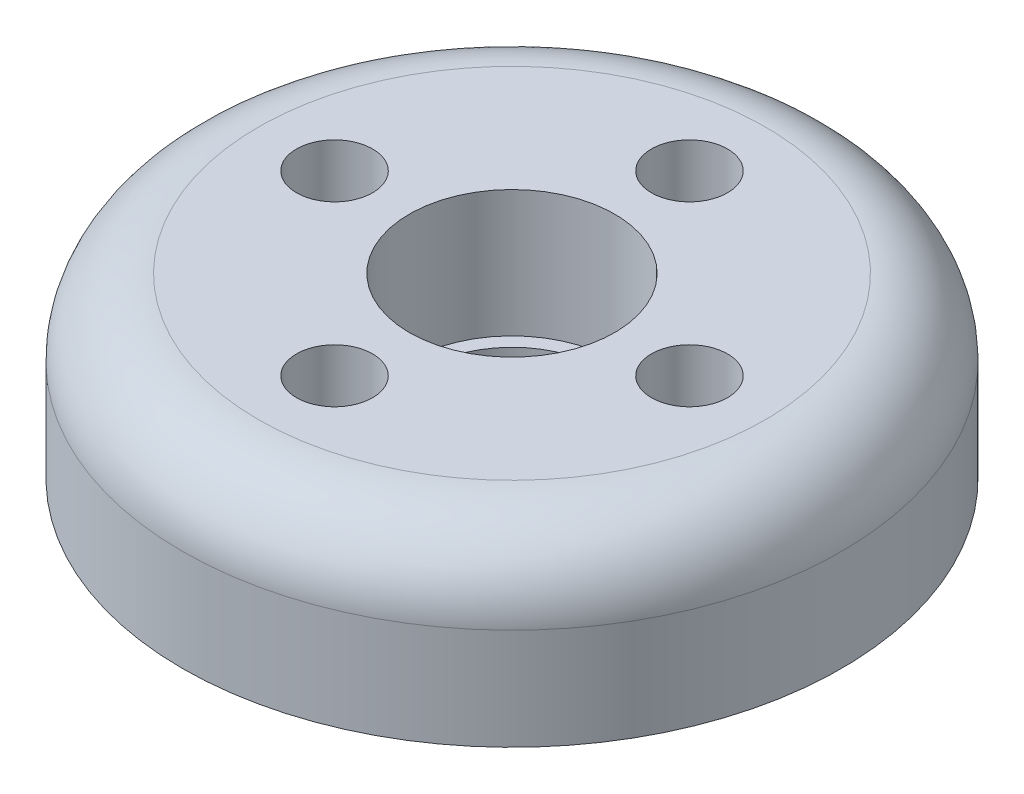
ISO-10303-21;
HEADER;
FILE_DESCRIPTION(('STEP AP214'),'2;1');
FILE_NAME('part.step','',(''),(''),'','','');
FILE_SCHEMA(('AUTOMOTIVE_DESIGN { 1 0 10303 214 1 1 1 1 }'));
ENDSEC;
DATA;
#1=APPLICATION_CONTEXT('core data for automotive mechanical design processes');
#2=APPLICATION_PROTOCOL_DEFINITION('international standard','automotive_design',2000,#1);
#3=PRODUCT_CONTEXT('',#1,'mechanical');
#4=PRODUCT('Part','Part','',(#3));
#5=PRODUCT_RELATED_PRODUCT_CATEGORY('part','',(#4));
#6=PRODUCT_DEFINITION_FORMATION('','',#4);
#7=PRODUCT_DEFINITION_CONTEXT('part definition',#1,'design');
#8=PRODUCT_DEFINITION('design','',#6,#7);
#9=PRODUCT_DEFINITION_SHAPE('','',#8);
#10=(LENGTH_UNIT() NAMED_UNIT(*) SI_UNIT(.MILLI.,.METRE.));
#11=(NAMED_UNIT(*) PLANE_ANGLE_UNIT() SI_UNIT($,.RADIAN.));
#12=(NAMED_UNIT(*) SI_UNIT($,.STERADIAN.) SOLID_ANGLE_UNIT());
#13=UNCERTAINTY_MEASURE_WITH_UNIT(LENGTH_MEASURE(1.E-05),#10,'distance_accuracy_value','');
#14=(GEOMETRIC_REPRESENTATION_CONTEXT(3) GLOBAL_UNCERTAINTY_ASSIGNED_CONTEXT((#13)) GLOBAL_UNIT_ASSIGNED_CONTEXT((#10,
#11,#12)) REPRESENTATION_CONTEXT('',''));
#15=CARTESIAN_POINT('',(0.,0.,0.));
#16=DIRECTION('',(0.,0.,1.));
#17=DIRECTION('',(1.,0.,0.));
#18=AXIS2_PLACEMENT_3D('',#15,#16,#17);
#19=CARTESIAN_POINT('',(0.,7.,0.));
#20=DIRECTION('',(0.,-1.,0.));
#21=DIRECTION('',(0.,0.,-1.));
#22=AXIS2_PLACEMENT_3D('',#19,#20,#21);
#23=CYLINDRICAL_SURFACE('',#22,3.5);
#24=CARTESIAN_POINT('',(0.,0.,0.));
#25=DIRECTION('',(0.,1.,0.));
#26=DIRECTION('',(0.,0.,1.));
#27=AXIS2_PLACEMENT_3D('',#24,#25,#26);
#28=CIRCLE('',#27,3.5);
#29=CARTESIAN_POINT('',(0.,0.,3.5));
#30=VERTEX_POINT('',#29);
#31=EDGE_CURVE('E46',#30,#30,#28,.T.);
#32=ORIENTED_EDGE('',*,*,#31,.F.);
#33=EDGE_LOOP('',(#32));
#34=FACE_BOUND('',#33,.T.);
#35=CARTESIAN_POINT('',(0.,2.,0.));
#36=DIRECTION('',(0.,1.,0.));
#37=DIRECTION('',(0.,0.,1.));
#38=AXIS2_PLACEMENT_3D('',#35,#36,#37);
#39=CIRCLE('',#38,3.5);
#40=CARTESIAN_POINT('',(0.,2.,3.5));
#41=VERTEX_POINT('',#40);
#42=EDGE_CURVE('E49',#41,#41,#39,.T.);
#43=ORIENTED_EDGE('',*,*,#42,.T.);
#44=EDGE_LOOP('',(#43));
#45=FACE_BOUND('',#44,.T.);
#46=ADVANCED_FACE('F31',(#34,#45),#23,.F.);
#47=CARTESIAN_POINT('',(0.,7.,0.));
#48=DIRECTION('',(0.,1.,0.));
#49=DIRECTION('',(0.,0.,1.));
#50=AXIS2_PLACEMENT_3D('',#47,#48,#49);
#51=PLANE('',#50);
#52=CARTESIAN_POINT('',(0.,7.,0.));
#53=DIRECTION('',(0.,1.,0.));
#54=DIRECTION('',(0.,0.,1.));
#55=AXIS2_PLACEMENT_3D('',#52,#53,#54);
#56=CIRCLE('',#55,10.);
#57=CARTESIAN_POINT('',(0.,7.,10.));
#58=VERTEX_POINT('',#57);
#59=EDGE_CURVE('E38',#58,#58,#56,.T.);
#60=ORIENTED_EDGE('',*,*,#59,.T.);
#61=EDGE_LOOP('',(#60));
#62=FACE_BOUND('',#61,.T.);
#63=CARTESIAN_POINT('',(0.,7.,0.));
#64=DIRECTION('',(0.,1.,0.));
#65=DIRECTION('',(0.,0.,1.));
#66=AXIS2_PLACEMENT_3D('',#63,#64,#65);
#67=CIRCLE('',#66,4.05);
#68=CARTESIAN_POINT('',(0.,7.,4.05));
#69=VERTEX_POINT('',#68);
#70=EDGE_CURVE('E79',#69,#69,#67,.T.);
#71=ORIENTED_EDGE('',*,*,#70,.F.);
#72=EDGE_LOOP('',(#71));
#73=FACE_BOUND('',#72,.T.);
#74=CARTESIAN_POINT('',(0.,7.,7.));
#75=DIRECTION('',(0.,1.,0.));
#76=DIRECTION('',(0.,0.,1.));
#77=AXIS2_PLACEMENT_3D('',#74,#75,#76);
#78=CIRCLE('',#77,1.5);
#79=CARTESIAN_POINT('',(0.,7.,8.5));
#80=VERTEX_POINT('',#79);
#81=EDGE_CURVE('E66',#80,#80,#78,.T.);
#82=ORIENTED_EDGE('',*,*,#81,.F.);
#83=EDGE_LOOP('',(#82));
#84=FACE_BOUND('',#83,.T.);
#85=CARTESIAN_POINT('',(0.,7.,-7.));
#86=DIRECTION('',(0.,1.,0.));
#87=DIRECTION('',(0.,0.,1.));
#88=AXIS2_PLACEMENT_3D('',#85,#86,#87);
#89=CIRCLE('',#88,1.5);
#90=CARTESIAN_POINT('',(0.,7.,-5.5));
#91=VERTEX_POINT('',#90);
#92=EDGE_CURVE('E56',#91,#91,#89,.T.);
#93=ORIENTED_EDGE('',*,*,#92,.F.);
#94=EDGE_LOOP('',(#93));
#95=FACE_BOUND('',#94,.T.);
#96=CARTESIAN_POINT('',(7.,7.,0.));
#97=DIRECTION('',(0.,1.,0.));
#98=DIRECTION('',(0.,0.,1.));
#99=AXIS2_PLACEMENT_3D('',#96,#97,#98);
#100=CIRCLE('',#99,1.5);
#101=CARTESIAN_POINT('',(7.,7.,1.5));
#102=VERTEX_POINT('',#101);
#103=EDGE_CURVE('E60',#102,#102,#100,.T.);
#104=ORIENTED_EDGE('',*,*,#103,.F.);
#105=EDGE_LOOP('',(#104));
#106=FACE_BOUND('',#105,.T.);
#107=CARTESIAN_POINT('',(-7.,7.,0.));
#108=DIRECTION('',(0.,1.,0.));
#109=DIRECTION('',(0.,0.,1.));
#110=AXIS2_PLACEMENT_3D('',#107,#108,#109);
#111=CIRCLE('',#110,1.5);
#112=CARTESIAN_POINT('',(-7.,7.,1.5));
#113=VERTEX_POINT('',#112);
#114=EDGE_CURVE('E72',#113,#113,#111,.T.);
#115=ORIENTED_EDGE('',*,*,#114,.F.);
#116=EDGE_LOOP('',(#115));
#117=FACE_BOUND('',#116,.T.);
#118=ADVANCED_FACE('F94',(#62,#73,#84,#95,#106,#117),#51,.T.);
#119=CARTESIAN_POINT('',(0.,0.,0.));
#120=DIRECTION('',(0.,1.,0.));
#121=DIRECTION('',(0.,0.,1.));
#122=AXIS2_PLACEMENT_3D('',#119,#120,#121);
#123=PLANE('',#122);
#124=CARTESIAN_POINT('',(0.,0.,0.));
#125=DIRECTION('',(0.,1.,0.));
#126=DIRECTION('',(0.,0.,1.));
#127=AXIS2_PLACEMENT_3D('',#124,#125,#126);
#128=CIRCLE('',#127,13.);
#129=CARTESIAN_POINT('',(0.,0.,13.));
#130=VERTEX_POINT('',#129);
#131=EDGE_CURVE('E42',#130,#130,#128,.T.);
#132=ORIENTED_EDGE('',*,*,#131,.F.);
#133=EDGE_LOOP('',(#132));
#134=FACE_BOUND('',#133,.T.);
#135=ORIENTED_EDGE('',*,*,#31,.T.);
#136=EDGE_LOOP('',(#135));
#137=FACE_BOUND('',#136,.T.);
#138=CARTESIAN_POINT('',(0.,0.,-7.));
#139=DIRECTION('',(0.,1.,0.));
#140=DIRECTION('',(0.,0.,1.));
#141=AXIS2_PLACEMENT_3D('',#138,#139,#140);
#142=CIRCLE('',#141,1.5);
#143=CARTESIAN_POINT('',(0.,0.,-5.5));
#144=VERTEX_POINT('',#143);
#145=EDGE_CURVE('E57',#144,#144,#142,.T.);
#146=ORIENTED_EDGE('',*,*,#145,.T.);
#147=EDGE_LOOP('',(#146));
#148=FACE_BOUND('',#147,.T.);
#149=CARTESIAN_POINT('',(7.,0.,0.));
#150=DIRECTION('',(0.,1.,0.));
#151=DIRECTION('',(0.,0.,1.));
#152=AXIS2_PLACEMENT_3D('',#149,#150,#151);
#153=CIRCLE('',#152,1.5);
#154=CARTESIAN_POINT('',(7.,0.,1.5));
#155=VERTEX_POINT('',#154);
#156=EDGE_CURVE('E63',#155,#155,#153,.T.);
#157=ORIENTED_EDGE('',*,*,#156,.T.);
#158=EDGE_LOOP('',(#157));
#159=FACE_BOUND('',#158,.T.);
#160=CARTESIAN_POINT('',(0.,0.,7.));
#161=DIRECTION('',(0.,1.,0.));
#162=DIRECTION('',(0.,0.,1.));
#163=AXIS2_PLACEMENT_3D('',#160,#161,#162);
#164=CIRCLE('',#163,1.5);
#165=CARTESIAN_POINT('',(0.,0.,8.5));
#166=VERTEX_POINT('',#165);
#167=EDGE_CURVE('E69',#166,#166,#164,.T.);
#168=ORIENTED_EDGE('',*,*,#167,.T.);
#169=EDGE_LOOP('',(#168));
#170=FACE_BOUND('',#169,.T.);
#171=CARTESIAN_POINT('',(-7.,0.,0.));
#172=DIRECTION('',(0.,1.,0.));
#173=DIRECTION('',(0.,0.,1.));
#174=AXIS2_PLACEMENT_3D('',#171,#172,#173);
#175=CIRCLE('',#174,1.5);
#176=CARTESIAN_POINT('',(-7.,0.,1.5));
#177=VERTEX_POINT('',#176);
#178=EDGE_CURVE('E51',#177,#177,#175,.T.);
#179=ORIENTED_EDGE('',*,*,#178,.T.);
#180=EDGE_LOOP('',(#179));
#181=FACE_BOUND('',#180,.T.);
#182=ADVANCED_FACE('F97',(#134,#137,#148,#159,#170,#181),#123,.F.);
#183=CARTESIAN_POINT('',(0.,7.,0.));
#184=DIRECTION('',(0.,-1.,0.));
#185=DIRECTION('',(0.,0.,-1.));
#186=AXIS2_PLACEMENT_3D('',#183,#184,#185);
#187=CYLINDRICAL_SURFACE('',#186,13.);
#188=CARTESIAN_POINT('',(0.,4.,0.));
#189=DIRECTION('',(0.,1.,0.));
#190=DIRECTION('',(0.,0.,1.));
#191=AXIS2_PLACEMENT_3D('',#188,#189,#190);
#192=CIRCLE('',#191,13.);
#193=CARTESIAN_POINT('',(0.,4.,13.));
#194=VERTEX_POINT('',#193);
#195=EDGE_CURVE('E10',#194,#194,#192,.F.);
#196=ORIENTED_EDGE('',*,*,#195,.T.);
#197=EDGE_LOOP('',(#196));
#198=FACE_BOUND('',#197,.T.);
#199=ORIENTED_EDGE('',*,*,#131,.T.);
#200=EDGE_LOOP('',(#199));
#201=FACE_BOUND('',#200,.T.);
#202=ADVANCED_FACE('F114',(#198,#201),#187,.T.);
#203=CARTESIAN_POINT('',(0.,7.,-7.));
#204=DIRECTION('',(0.,-1.,0.));
#205=DIRECTION('',(0.,0.,-1.));
#206=AXIS2_PLACEMENT_3D('',#203,#204,#205);
#207=CYLINDRICAL_SURFACE('',#206,1.5);
#208=ORIENTED_EDGE('',*,*,#92,.T.);
#209=EDGE_LOOP('',(#208));
#210=FACE_BOUND('',#209,.T.);
#211=ORIENTED_EDGE('',*,*,#145,.F.);
#212=EDGE_LOOP('',(#211));
#213=FACE_BOUND('',#212,.T.);
#214=ADVANCED_FACE('F120',(#210,#213),#207,.F.);
#215=CARTESIAN_POINT('',(7.,7.,0.));
#216=DIRECTION('',(0.,-1.,0.));
#217=DIRECTION('',(0.,0.,-1.));
#218=AXIS2_PLACEMENT_3D('',#215,#216,#217);
#219=CYLINDRICAL_SURFACE('',#218,1.5);
#220=ORIENTED_EDGE('',*,*,#103,.T.);
#221=EDGE_LOOP('',(#220));
#222=FACE_BOUND('',#221,.T.);
#223=ORIENTED_EDGE('',*,*,#156,.F.);
#224=EDGE_LOOP('',(#223));
#225=FACE_BOUND('',#224,.T.);
#226=ADVANCED_FACE('F133',(#222,#225),#219,.F.);
#227=CARTESIAN_POINT('',(0.,7.,7.));
#228=DIRECTION('',(0.,-1.,0.));
#229=DIRECTION('',(0.,0.,-1.));
#230=AXIS2_PLACEMENT_3D('',#227,#228,#229);
#231=CYLINDRICAL_SURFACE('',#230,1.5);
#232=ORIENTED_EDGE('',*,*,#81,.T.);
#233=EDGE_LOOP('',(#232));
#234=FACE_BOUND('',#233,.T.);
#235=ORIENTED_EDGE('',*,*,#167,.F.);
#236=EDGE_LOOP('',(#235));
#237=FACE_BOUND('',#236,.T.);
#238=ADVANCED_FACE('F109',(#234,#237),#231,.F.);
#239=CARTESIAN_POINT('',(-7.,7.,0.));
#240=DIRECTION('',(0.,-1.,0.));
#241=DIRECTION('',(0.,0.,-1.));
#242=AXIS2_PLACEMENT_3D('',#239,#240,#241);
#243=CYLINDRICAL_SURFACE('',#242,1.5);
#244=ORIENTED_EDGE('',*,*,#114,.T.);
#245=EDGE_LOOP('',(#244));
#246=FACE_BOUND('',#245,.T.);
#247=ORIENTED_EDGE('',*,*,#178,.F.);
#248=EDGE_LOOP('',(#247));
#249=FACE_BOUND('',#248,.T.);
#250=ADVANCED_FACE('F90',(#246,#249),#243,.F.);
#251=CARTESIAN_POINT('',(0.,2.,0.));
#252=DIRECTION('',(0.,1.,0.));
#253=DIRECTION('',(0.,0.,1.));
#254=AXIS2_PLACEMENT_3D('',#251,#252,#253);
#255=CYLINDRICAL_SURFACE('',#254,4.05);
#256=CARTESIAN_POINT('',(0.,2.,0.));
#257=DIRECTION('',(0.,1.,0.));
#258=DIRECTION('',(0.,0.,1.));
#259=AXIS2_PLACEMENT_3D('',#256,#257,#258);
#260=CIRCLE('',#259,4.05);
#261=CARTESIAN_POINT('',(0.,2.,4.05));
#262=VERTEX_POINT('',#261);
#263=EDGE_CURVE('E52',#262,#262,#260,.T.);
#264=ORIENTED_EDGE('',*,*,#263,.F.);
#265=EDGE_LOOP('',(#264));
#266=FACE_BOUND('',#265,.T.);
#267=ORIENTED_EDGE('',*,*,#70,.T.);
#268=EDGE_LOOP('',(#267));
#269=FACE_BOUND('',#268,.T.);
#270=ADVANCED_FACE('F87',(#266,#269),#255,.F.);
#271=CARTESIAN_POINT('',(0.,2.,0.));
#272=DIRECTION('',(0.,1.,0.));
#273=DIRECTION('',(0.,0.,1.));
#274=AXIS2_PLACEMENT_3D('',#271,#272,#273);
#275=PLANE('',#274);
#276=ORIENTED_EDGE('',*,*,#42,.F.);
#277=EDGE_LOOP('',(#276));
#278=FACE_BOUND('',#277,.T.);
#279=ORIENTED_EDGE('',*,*,#263,.T.);
#280=EDGE_LOOP('',(#279));
#281=FACE_BOUND('',#280,.T.);
#282=ADVANCED_FACE('F85',(#278,#281),#275,.T.);
#283=CARTESIAN_POINT('',(0.,4.,0.));
#284=DIRECTION('',(0.,1.,0.));
#285=DIRECTION('',(0.,0.,1.));
#286=AXIS2_PLACEMENT_3D('',#283,#284,#285);
#287=TOROIDAL_SURFACE('',#286,10.,3.);
#288=ORIENTED_EDGE('',*,*,#195,.F.);
#289=EDGE_LOOP('',(#288));
#290=FACE_BOUND('',#289,.T.);
#291=ORIENTED_EDGE('',*,*,#59,.F.);
#292=EDGE_LOOP('',(#291));
#293=FACE_BOUND('',#292,.T.);
#294=ADVANCED_FACE('F33',(#290,#293),#287,.T.);
#295=CLOSED_SHELL('',(#46,#118,#182,#202,#214,#226,#238,#250,#270,#282,#294));
#296=MANIFOLD_SOLID_BREP('B2',#295);
#297=ADVANCED_BREP_SHAPE_REPRESENTATION('',(#18,#296),#14);
#298=SHAPE_DEFINITION_REPRESENTATION(#9,#297);
ENDSEC;
END-ISO-10303-21;
